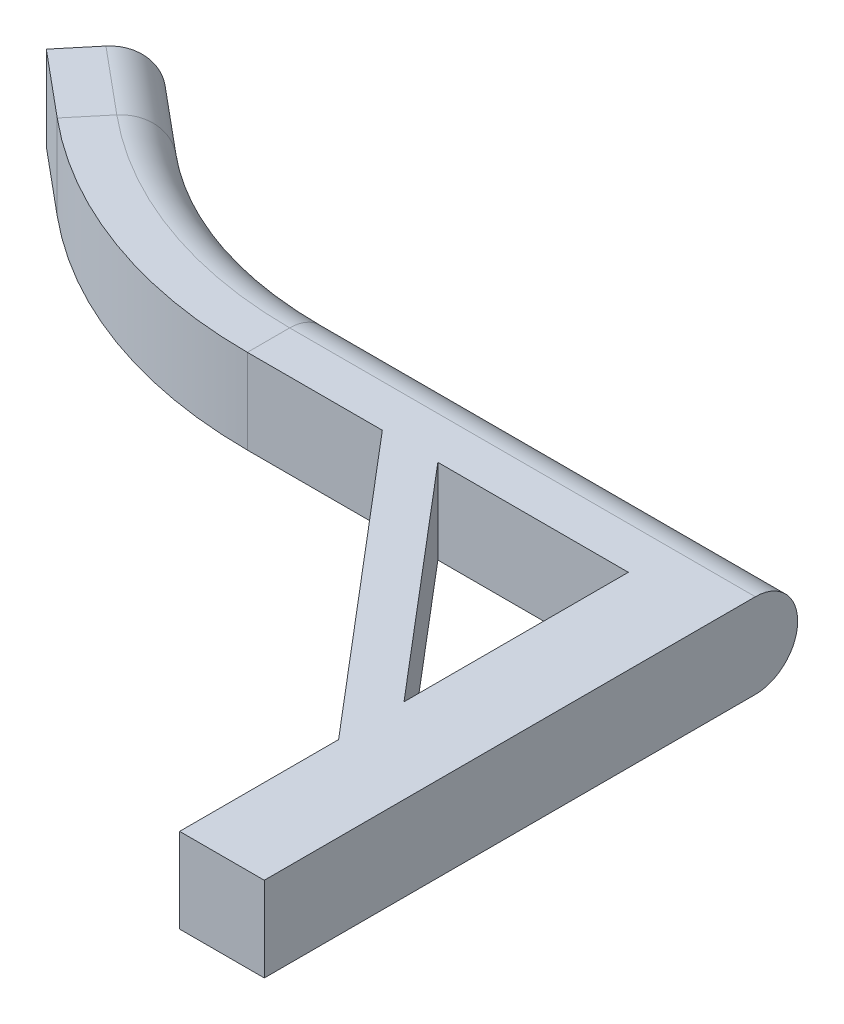
ISO-10303-21;
HEADER;
FILE_DESCRIPTION(('STEP AP214'),'2;1');
FILE_NAME('part.step','',(''),(''),'','','');
FILE_SCHEMA(('AUTOMOTIVE_DESIGN { 1 0 10303 214 1 1 1 1 }'));
ENDSEC;
DATA;
#1=APPLICATION_CONTEXT('core data for automotive mechanical design processes');
#2=APPLICATION_PROTOCOL_DEFINITION('international standard','automotive_design',2000,#1);
#3=PRODUCT_CONTEXT('',#1,'mechanical');
#4=PRODUCT('Part','Part','',(#3));
#5=PRODUCT_RELATED_PRODUCT_CATEGORY('part','',(#4));
#6=PRODUCT_DEFINITION_FORMATION('','',#4);
#7=PRODUCT_DEFINITION_CONTEXT('part definition',#1,'design');
#8=PRODUCT_DEFINITION('design','',#6,#7);
#9=PRODUCT_DEFINITION_SHAPE('','',#8);
#10=(LENGTH_UNIT() NAMED_UNIT(*) SI_UNIT(.MILLI.,.METRE.));
#11=(NAMED_UNIT(*) PLANE_ANGLE_UNIT() SI_UNIT($,.RADIAN.));
#12=(NAMED_UNIT(*) SI_UNIT($,.STERADIAN.) SOLID_ANGLE_UNIT());
#13=UNCERTAINTY_MEASURE_WITH_UNIT(LENGTH_MEASURE(1.E-05),#10,'distance_accuracy_value','');
#14=(GEOMETRIC_REPRESENTATION_CONTEXT(3) GLOBAL_UNCERTAINTY_ASSIGNED_CONTEXT((#13)) GLOBAL_UNIT_ASSIGNED_CONTEXT((#10,
#11,#12)) REPRESENTATION_CONTEXT('',''));
#15=CARTESIAN_POINT('',(0.,0.,0.));
#16=DIRECTION('',(0.,0.,1.));
#17=DIRECTION('',(1.,0.,0.));
#18=AXIS2_PLACEMENT_3D('',#15,#16,#17);
#19=CARTESIAN_POINT('',(2.84999999999999,2.5,-12.));
#20=DIRECTION('',(0.,0.,-1.));
#21=DIRECTION('',(-1.,0.,0.));
#22=AXIS2_PLACEMENT_3D('',#19,#20,#21);
#23=PLANE('',#22);
#24=DIRECTION('',(-1.,0.,0.));
#25=VECTOR('',#24,1.);
#26=CARTESIAN_POINT('',(2.84999999999999,2.5,-12.));
#27=LINE('',#26,#25);
#28=CARTESIAN_POINT('',(-2.50000000000001,2.5,-12.));
#29=VERTEX_POINT('',#28);
#30=CARTESIAN_POINT('',(-13.75,2.5,-12.));
#31=VERTEX_POINT('',#30);
#32=EDGE_CURVE('E173',#29,#31,#27,.T.);
#33=ORIENTED_EDGE('',*,*,#32,.T.);
#34=DIRECTION('',(0.,1.,0.));
#35=VECTOR('',#34,1.);
#36=CARTESIAN_POINT('',(-13.75,-24.9488292496471,-12.));
#37=LINE('',#36,#35);
#38=CARTESIAN_POINT('',(-13.75,-2.5,-12.));
#39=VERTEX_POINT('',#38);
#40=EDGE_CURVE('E65',#39,#31,#37,.T.);
#41=ORIENTED_EDGE('',*,*,#40,.F.);
#42=DIRECTION('',(-1.,0.,0.));
#43=VECTOR('',#42,1.);
#44=CARTESIAN_POINT('',(2.84999999999999,-2.5,-12.));
#45=LINE('',#44,#43);
#46=CARTESIAN_POINT('',(-2.50000000000001,-2.5,-12.));
#47=VERTEX_POINT('',#46);
#48=EDGE_CURVE('E174',#47,#39,#45,.T.);
#49=ORIENTED_EDGE('',*,*,#48,.F.);
#50=DIRECTION('',(0.,1.,0.));
#51=VECTOR('',#50,1.);
#52=CARTESIAN_POINT('',(-2.50000000000001,2.5,-12.));
#53=LINE('',#52,#51);
#54=EDGE_CURVE('E215',#47,#29,#53,.T.);
#55=ORIENTED_EDGE('',*,*,#54,.T.);
#56=EDGE_LOOP('',(#33,#41,#49,#55));
#57=FACE_BOUND('',#56,.T.);
#58=ADVANCED_FACE('F39',(#57),#23,.F.);
#59=CARTESIAN_POINT('',(-2.5,2.5,14.5));
#60=DIRECTION('',(1.,0.,0.));
#61=DIRECTION('',(0.,0.,-1.));
#62=AXIS2_PLACEMENT_3D('',#59,#60,#61);
#63=PLANE('',#62);
#64=DIRECTION('',(0.,0.,-1.));
#65=VECTOR('',#64,1.);
#66=CARTESIAN_POINT('',(-2.5,-2.5,14.5));
#67=LINE('',#66,#65);
#68=CARTESIAN_POINT('',(-2.5,-2.5,1.25));
#69=VERTEX_POINT('',#68);
#70=EDGE_CURVE('E226',#69,#47,#67,.T.);
#71=ORIENTED_EDGE('',*,*,#70,.F.);
#72=DIRECTION('',(0.,1.,0.));
#73=VECTOR('',#72,1.);
#74=CARTESIAN_POINT('',(-2.5,-24.9488292496471,1.25));
#75=LINE('',#74,#73);
#76=CARTESIAN_POINT('',(-2.5,2.5,1.25));
#77=VERTEX_POINT('',#76);
#78=EDGE_CURVE('E196',#69,#77,#75,.T.);
#79=ORIENTED_EDGE('',*,*,#78,.T.);
#80=DIRECTION('',(0.,0.,-1.));
#81=VECTOR('',#80,1.);
#82=CARTESIAN_POINT('',(-2.5,2.5,14.5));
#83=LINE('',#82,#81);
#84=EDGE_CURVE('E230',#77,#29,#83,.T.);
#85=ORIENTED_EDGE('',*,*,#84,.T.);
#86=ORIENTED_EDGE('',*,*,#54,.F.);
#87=EDGE_LOOP('',(#71,#79,#85,#86));
#88=FACE_BOUND('',#87,.T.);
#89=ADVANCED_FACE('F422',(#88),#63,.F.);
#90=CARTESIAN_POINT('',(-44.8418745424597,0.,-23.4906272877014));
#91=DIRECTION('',(0.768374908491942,0.,0.64));
#92=DIRECTION('',(0.64,0.,-0.768374908491942));
#93=AXIS2_PLACEMENT_3D('',#90,#91,#92);
#94=PLANE('',#93);
#95=CARTESIAN_POINT('',(-44.8418745424597,0.,-23.4906272877014));
#96=DIRECTION('',(0.768374908491942,0.,0.64));
#97=DIRECTION('',(0.64,0.,-0.768374908491942));
#98=AXIS2_PLACEMENT_3D('',#95,#96,#97);
#99=CIRCLE('',#98,2.5);
#100=CARTESIAN_POINT('',(-44.8418745424597,2.5,-23.4906272877014));
#101=VERTEX_POINT('',#100);
#102=CARTESIAN_POINT('',(-43.2418745424597,0.,-25.4115645589313));
#103=VERTEX_POINT('',#102);
#104=EDGE_CURVE('E210',#101,#103,#99,.F.);
#105=ORIENTED_EDGE('',*,*,#104,.T.);
#106=CARTESIAN_POINT('',(-44.8418745424597,0.,-23.4906272877014));
#107=DIRECTION('',(0.768374908491942,0.,0.64));
#108=DIRECTION('',(0.64,0.,-0.768374908491942));
#109=AXIS2_PLACEMENT_3D('',#106,#107,#108);
#110=CIRCLE('',#109,2.5);
#111=CARTESIAN_POINT('',(-44.8418745424597,-2.5,-23.4906272877014));
#112=VERTEX_POINT('',#111);
#113=EDGE_CURVE('E302',#103,#112,#110,.F.);
#114=ORIENTED_EDGE('',*,*,#113,.T.);
#115=DIRECTION('',(0.64,0.,-0.768374908491942));
#116=VECTOR('',#115,1.);
#117=CARTESIAN_POINT('',(-46.4418745424597,-2.5,-21.5696900164716));
#118=LINE('',#117,#116);
#119=CARTESIAN_POINT('',(-46.4418745424597,-2.5,-21.5696900164716));
#120=VERTEX_POINT('',#119);
#121=EDGE_CURVE('E254',#120,#112,#118,.T.);
#122=ORIENTED_EDGE('',*,*,#121,.F.);
#123=DIRECTION('',(0.,-1.,0.));
#124=VECTOR('',#123,1.);
#125=CARTESIAN_POINT('',(-46.4418745424597,2.5,-21.5696900164716));
#126=LINE('',#125,#124);
#127=CARTESIAN_POINT('',(-46.4418745424597,2.5,-21.5696900164716));
#128=VERTEX_POINT('',#127);
#129=EDGE_CURVE('E279',#128,#120,#126,.T.);
#130=ORIENTED_EDGE('',*,*,#129,.F.);
#131=DIRECTION('',(-0.64,0.,0.768374908491942));
#132=VECTOR('',#131,1.);
#133=CARTESIAN_POINT('',(-46.4418745424597,2.5,-21.5696900164716));
#134=LINE('',#133,#132);
#135=EDGE_CURVE('E251',#101,#128,#134,.T.);
#136=ORIENTED_EDGE('',*,*,#135,.F.);
#137=EDGE_LOOP('',(#105,#114,#122,#130,#136));
#138=FACE_BOUND('',#137,.T.);
#139=ADVANCED_FACE('F396',(#138),#94,.F.);
#140=CARTESIAN_POINT('',(0.,0.,14.5));
#141=DIRECTION('',(0.,0.,1.));
#142=DIRECTION('',(1.,0.,0.));
#143=AXIS2_PLACEMENT_3D('',#140,#141,#142);
#144=PLANE('',#143);
#145=DIRECTION('',(0.,1.,0.));
#146=VECTOR('',#145,1.);
#147=CARTESIAN_POINT('',(2.5,2.5,14.5));
#148=LINE('',#147,#146);
#149=CARTESIAN_POINT('',(2.5,-2.5,14.5));
#150=VERTEX_POINT('',#149);
#151=CARTESIAN_POINT('',(2.5,2.5,14.5));
#152=VERTEX_POINT('',#151);
#153=EDGE_CURVE('E234',#150,#152,#148,.T.);
#154=ORIENTED_EDGE('',*,*,#153,.T.);
#155=DIRECTION('',(-1.,0.,0.));
#156=VECTOR('',#155,1.);
#157=CARTESIAN_POINT('',(-2.5,2.5,14.5));
#158=LINE('',#157,#156);
#159=CARTESIAN_POINT('',(-2.5,2.5,14.5));
#160=VERTEX_POINT('',#159);
#161=EDGE_CURVE('E242',#152,#160,#158,.T.);
#162=ORIENTED_EDGE('',*,*,#161,.T.);
#163=DIRECTION('',(0.,-1.,0.));
#164=VECTOR('',#163,1.);
#165=CARTESIAN_POINT('',(-2.5,2.5,14.5));
#166=LINE('',#165,#164);
#167=CARTESIAN_POINT('',(-2.5,-2.5,14.5));
#168=VERTEX_POINT('',#167);
#169=EDGE_CURVE('E216',#160,#168,#166,.T.);
#170=ORIENTED_EDGE('',*,*,#169,.T.);
#171=DIRECTION('',(1.,0.,0.));
#172=VECTOR('',#171,1.);
#173=CARTESIAN_POINT('',(-2.5,-2.5,14.5));
#174=LINE('',#173,#172);
#175=EDGE_CURVE('E220',#168,#150,#174,.T.);
#176=ORIENTED_EDGE('',*,*,#175,.T.);
#177=EDGE_LOOP('',(#154,#162,#170,#176));
#178=FACE_BOUND('',#177,.T.);
#179=ADVANCED_FACE('F372',(#178),#144,.T.);
#180=CARTESIAN_POINT('',(-17.0295742067488,-2.5,-12.));
#181=VERTEX_POINT('',#180);
#182=CARTESIAN_POINT('',(-25.,-2.5,-12.));
#183=VERTEX_POINT('',#182);
#184=EDGE_CURVE('E57',#181,#183,#45,.T.);
#185=ORIENTED_EDGE('',*,*,#184,.F.);
#186=DIRECTION('',(0.,1.,0.));
#187=VECTOR('',#186,1.);
#188=CARTESIAN_POINT('',(-17.0295742067488,-24.9488292496471,-12.));
#189=LINE('',#188,#187);
#190=CARTESIAN_POINT('',(-17.0295742067488,2.5,-12.));
#191=VERTEX_POINT('',#190);
#192=EDGE_CURVE('E177',#181,#191,#189,.T.);
#193=ORIENTED_EDGE('',*,*,#192,.T.);
#194=CARTESIAN_POINT('',(-25.,2.5,-12.));
#195=VERTEX_POINT('',#194);
#196=EDGE_CURVE('E162',#191,#195,#27,.T.);
#197=ORIENTED_EDGE('',*,*,#196,.T.);
#198=DIRECTION('',(0.,-1.,0.));
#199=VECTOR('',#198,1.);
#200=CARTESIAN_POINT('',(-25.,2.5,-12.));
#201=LINE('',#200,#199);
#202=EDGE_CURVE('E275',#195,#183,#201,.T.);
#203=ORIENTED_EDGE('',*,*,#202,.T.);
#204=EDGE_LOOP('',(#185,#193,#197,#203));
#205=FACE_BOUND('',#204,.T.);
#206=ADVANCED_FACE('F178',(#205),#23,.F.);
#207=CARTESIAN_POINT('',(-25.,0.,-39.5));
#208=DIRECTION('',(0.,-1.,0.));
#209=DIRECTION('',(0.,0.,-1.));
#210=AXIS2_PLACEMENT_3D('',#207,#208,#209);
#211=CYLINDRICAL_SURFACE('',#210,27.5);
#212=CARTESIAN_POINT('',(-25.,-2.5,-39.5));
#213=DIRECTION('',(0.,-1.,0.));
#214=DIRECTION('',(0.,0.,1.));
#215=AXIS2_PLACEMENT_3D('',#212,#213,#214);
#216=CIRCLE('',#215,27.5);
#217=CARTESIAN_POINT('',(-42.6,-2.5,-18.3696900164716));
#218=VERTEX_POINT('',#217);
#219=EDGE_CURVE('E271',#183,#218,#216,.T.);
#220=ORIENTED_EDGE('',*,*,#219,.F.);
#221=ORIENTED_EDGE('',*,*,#202,.F.);
#222=CARTESIAN_POINT('',(-25.,2.5,-39.5));
#223=DIRECTION('',(0.,-1.,0.));
#224=DIRECTION('',(0.,0.,1.));
#225=AXIS2_PLACEMENT_3D('',#222,#223,#224);
#226=CIRCLE('',#225,27.5);
#227=CARTESIAN_POINT('',(-42.6,2.5,-18.3696900164716));
#228=VERTEX_POINT('',#227);
#229=EDGE_CURVE('E263',#195,#228,#226,.T.);
#230=ORIENTED_EDGE('',*,*,#229,.T.);
#231=DIRECTION('',(0.,-1.,0.));
#232=VECTOR('',#231,1.);
#233=CARTESIAN_POINT('',(-42.6,2.5,-18.3696900164716));
#234=LINE('',#233,#232);
#235=EDGE_CURVE('E288',#228,#218,#234,.T.);
#236=ORIENTED_EDGE('',*,*,#235,.T.);
#237=EDGE_LOOP('',(#220,#221,#230,#236));
#238=FACE_BOUND('',#237,.T.);
#239=ADVANCED_FACE('F405',(#238),#211,.T.);
#240=CARTESIAN_POINT('',(-25.,-2.5,-12.));
#241=DIRECTION('',(0.,1.,0.));
#242=DIRECTION('',(0.,0.,1.));
#243=AXIS2_PLACEMENT_3D('',#240,#241,#242);
#244=PLANE('',#243);
#245=DIRECTION('',(0.64,0.,-0.768374908491942));
#246=VECTOR('',#245,1.);
#247=CARTESIAN_POINT('',(-42.6,-2.5,-18.3696900164716));
#248=LINE('',#247,#246);
#249=CARTESIAN_POINT('',(-41.,-2.5,-20.2906272877014));
#250=VERTEX_POINT('',#249);
#251=EDGE_CURVE('E258',#218,#250,#248,.T.);
#252=ORIENTED_EDGE('',*,*,#251,.T.);
#253=CARTESIAN_POINT('',(-25.,-2.5,-39.5));
#254=DIRECTION('',(0.,1.,0.));
#255=DIRECTION('',(0.,0.,1.));
#256=AXIS2_PLACEMENT_3D('',#253,#254,#255);
#257=CIRCLE('',#256,25.);
#258=CARTESIAN_POINT('',(-25.,-2.5,-14.5));
#259=VERTEX_POINT('',#258);
#260=EDGE_CURVE('E309',#250,#259,#257,.T.);
#261=ORIENTED_EDGE('',*,*,#260,.T.);
#262=DIRECTION('',(0.,0.,-1.));
#263=VECTOR('',#262,1.);
#264=CARTESIAN_POINT('',(-25.,-2.5,-12.));
#265=LINE('',#264,#263);
#266=EDGE_CURVE('E262',#183,#259,#265,.T.);
#267=ORIENTED_EDGE('',*,*,#266,.F.);
#268=ORIENTED_EDGE('',*,*,#219,.T.);
#269=EDGE_LOOP('',(#252,#261,#267,#268));
#270=FACE_BOUND('',#269,.T.);
#271=ADVANCED_FACE('F409',(#270),#244,.F.);
#272=CARTESIAN_POINT('',(-25.,2.5,-12.));
#273=DIRECTION('',(0.,-1.,0.));
#274=DIRECTION('',(0.,0.,-1.));
#275=AXIS2_PLACEMENT_3D('',#272,#273,#274);
#276=PLANE('',#275);
#277=DIRECTION('',(0.,0.,1.));
#278=VECTOR('',#277,1.);
#279=CARTESIAN_POINT('',(-25.,2.5,-12.));
#280=LINE('',#279,#278);
#281=CARTESIAN_POINT('',(-25.,2.5,-14.5));
#282=VERTEX_POINT('',#281);
#283=EDGE_CURVE('E170',#282,#195,#280,.T.);
#284=ORIENTED_EDGE('',*,*,#283,.F.);
#285=CARTESIAN_POINT('',(-25.,2.5,-39.5));
#286=DIRECTION('',(0.,-1.,0.));
#287=DIRECTION('',(0.,0.,-1.));
#288=AXIS2_PLACEMENT_3D('',#285,#286,#287);
#289=CIRCLE('',#288,25.);
#290=CARTESIAN_POINT('',(-41.,2.5,-20.2906272877014));
#291=VERTEX_POINT('',#290);
#292=EDGE_CURVE('E315',#282,#291,#289,.T.);
#293=ORIENTED_EDGE('',*,*,#292,.T.);
#294=DIRECTION('',(-0.64,0.,0.768374908491942));
#295=VECTOR('',#294,1.);
#296=CARTESIAN_POINT('',(-42.6,2.5,-18.3696900164716));
#297=LINE('',#296,#295);
#298=EDGE_CURVE('E255',#291,#228,#297,.T.);
#299=ORIENTED_EDGE('',*,*,#298,.T.);
#300=ORIENTED_EDGE('',*,*,#229,.F.);
#301=EDGE_LOOP('',(#284,#293,#299,#300));
#302=FACE_BOUND('',#301,.T.);
#303=ADVANCED_FACE('F407',(#302),#276,.F.);
#304=CARTESIAN_POINT('',(-42.6,2.5,-18.3696900164716));
#305=DIRECTION('',(0.64,0.,-0.768374908491942));
#306=DIRECTION('',(-0.768374908491942,0.,-0.64));
#307=AXIS2_PLACEMENT_3D('',#304,#305,#306);
#308=PLANE('',#307);
#309=DIRECTION('',(-0.768374908491942,0.,-0.64));
#310=VECTOR('',#309,1.);
#311=CARTESIAN_POINT('',(-42.6,-2.5,-18.3696900164716));
#312=LINE('',#311,#310);
#313=EDGE_CURVE('E267',#218,#120,#312,.T.);
#314=ORIENTED_EDGE('',*,*,#313,.F.);
#315=ORIENTED_EDGE('',*,*,#235,.F.);
#316=DIRECTION('',(-0.768374908491942,0.,-0.64));
#317=VECTOR('',#316,1.);
#318=CARTESIAN_POINT('',(-42.6,2.5,-18.3696900164716));
#319=LINE('',#318,#317);
#320=EDGE_CURVE('E259',#228,#128,#319,.T.);
#321=ORIENTED_EDGE('',*,*,#320,.T.);
#322=ORIENTED_EDGE('',*,*,#129,.T.);
#323=EDGE_LOOP('',(#314,#315,#321,#322));
#324=FACE_BOUND('',#323,.T.);
#325=ADVANCED_FACE('F400',(#324),#308,.F.);
#326=CARTESIAN_POINT('',(-42.6,-2.5,-18.3696900164716));
#327=DIRECTION('',(0.,1.,0.));
#328=DIRECTION('',(0.,0.,1.));
#329=AXIS2_PLACEMENT_3D('',#326,#327,#328);
#330=PLANE('',#329);
#331=ORIENTED_EDGE('',*,*,#121,.T.);
#332=DIRECTION('',(-0.768374908491942,0.,-0.64));
#333=VECTOR('',#332,1.);
#334=CARTESIAN_POINT('',(-41.,-2.5,-20.2906272877014));
#335=LINE('',#334,#333);
#336=EDGE_CURVE('E305',#112,#250,#335,.F.);
#337=ORIENTED_EDGE('',*,*,#336,.T.);
#338=ORIENTED_EDGE('',*,*,#251,.F.);
#339=ORIENTED_EDGE('',*,*,#313,.T.);
#340=EDGE_LOOP('',(#331,#337,#338,#339));
#341=FACE_BOUND('',#340,.T.);
#342=ADVANCED_FACE('F415',(#341),#330,.F.);
#343=CARTESIAN_POINT('',(-42.6,2.5,-18.3696900164716));
#344=DIRECTION('',(0.,-1.,0.));
#345=DIRECTION('',(0.,0.,-1.));
#346=AXIS2_PLACEMENT_3D('',#343,#344,#345);
#347=PLANE('',#346);
#348=ORIENTED_EDGE('',*,*,#298,.F.);
#349=DIRECTION('',(-0.768374908491942,0.,-0.64));
#350=VECTOR('',#349,1.);
#351=CARTESIAN_POINT('',(-41.,2.5,-20.2906272877014));
#352=LINE('',#351,#350);
#353=EDGE_CURVE('E312',#291,#101,#352,.T.);
#354=ORIENTED_EDGE('',*,*,#353,.T.);
#355=ORIENTED_EDGE('',*,*,#135,.T.);
#356=ORIENTED_EDGE('',*,*,#320,.F.);
#357=EDGE_LOOP('',(#348,#354,#355,#356));
#358=FACE_BOUND('',#357,.T.);
#359=ADVANCED_FACE('F392',(#358),#347,.F.);
#360=CARTESIAN_POINT('',(-2.5,2.5,14.5));
#361=DIRECTION('',(0.,-1.,0.));
#362=DIRECTION('',(1.,0.,0.));
#363=AXIS2_PLACEMENT_3D('',#360,#361,#362);
#364=PLANE('',#363);
#365=DIRECTION('',(-1.,0.,0.));
#366=VECTOR('',#365,1.);
#367=CARTESIAN_POINT('',(2.84999999999999,2.5,-14.5));
#368=LINE('',#367,#366);
#369=CARTESIAN_POINT('',(0.,2.5,-14.5));
#370=VERTEX_POINT('',#369);
#371=EDGE_CURVE('E49',#370,#282,#368,.T.);
#372=ORIENTED_EDGE('',*,*,#371,.T.);
#373=ORIENTED_EDGE('',*,*,#283,.T.);
#374=ORIENTED_EDGE('',*,*,#196,.F.);
#375=DIRECTION('',(0.647230821935947,0.,0.762294079169003));
#376=VECTOR('',#375,1.);
#377=CARTESIAN_POINT('',(-17.0295742067488,2.5,-12.));
#378=LINE('',#377,#376);
#379=CARTESIAN_POINT('',(-2.5,2.5,5.11260962128193));
#380=VERTEX_POINT('',#379);
#381=EDGE_CURVE('E167',#191,#380,#378,.T.);
#382=ORIENTED_EDGE('',*,*,#381,.T.);
#383=EDGE_CURVE('E227',#160,#380,#83,.T.);
#384=ORIENTED_EDGE('',*,*,#383,.F.);
#385=ORIENTED_EDGE('',*,*,#161,.F.);
#386=DIRECTION('',(0.,0.,-1.));
#387=VECTOR('',#386,1.);
#388=CARTESIAN_POINT('',(2.5,2.5,14.5));
#389=LINE('',#388,#387);
#390=CARTESIAN_POINT('',(2.49999999999999,2.5,-14.5));
#391=VERTEX_POINT('',#390);
#392=EDGE_CURVE('E238',#152,#391,#389,.T.);
#393=ORIENTED_EDGE('',*,*,#392,.T.);
#394=DIRECTION('',(-1.,0.,0.));
#395=VECTOR('',#394,1.);
#396=CARTESIAN_POINT('',(1.24999999999999,2.5,-14.5));
#397=LINE('',#396,#395);
#398=EDGE_CURVE('E11',#391,#370,#397,.T.);
#399=ORIENTED_EDGE('',*,*,#398,.T.);
#400=EDGE_LOOP('',(#372,#373,#374,#382,#384,#385,#393,#399));
#401=FACE_BOUND('',#400,.T.);
#402=ORIENTED_EDGE('',*,*,#84,.F.);
#403=DIRECTION('',(-0.647230821935947,0.,-0.762294079169003));
#404=VECTOR('',#403,1.);
#405=CARTESIAN_POINT('',(-13.75,2.5,-12.));
#406=LINE('',#405,#404);
#407=EDGE_CURVE('E182',#77,#31,#406,.T.);
#408=ORIENTED_EDGE('',*,*,#407,.T.);
#409=ORIENTED_EDGE('',*,*,#32,.F.);
#410=EDGE_LOOP('',(#402,#408,#409));
#411=FACE_BOUND('',#410,.T.);
#412=ADVANCED_FACE('F164',(#401,#411),#364,.F.);
#413=CARTESIAN_POINT('',(2.5,2.5,14.5));
#414=DIRECTION('',(-1.,0.,0.));
#415=DIRECTION('',(0.,0.,1.));
#416=AXIS2_PLACEMENT_3D('',#413,#414,#415);
#417=PLANE('',#416);
#418=DIRECTION('',(0.,0.,-1.));
#419=VECTOR('',#418,1.);
#420=CARTESIAN_POINT('',(2.5,-2.5,14.5));
#421=LINE('',#420,#419);
#422=CARTESIAN_POINT('',(2.49999999999999,-2.5,-14.5));
#423=VERTEX_POINT('',#422);
#424=EDGE_CURVE('E225',#150,#423,#421,.T.);
#425=ORIENTED_EDGE('',*,*,#424,.T.);
#426=CARTESIAN_POINT('',(2.49999999999999,0.,-14.5));
#427=DIRECTION('',(-1.,0.,0.));
#428=DIRECTION('',(0.,0.,1.));
#429=AXIS2_PLACEMENT_3D('',#426,#427,#428);
#430=CIRCLE('',#429,2.5);
#431=CARTESIAN_POINT('',(2.49999999999999,0.,-17.));
#432=VERTEX_POINT('',#431);
#433=EDGE_CURVE('E327',#423,#432,#430,.F.);
#434=ORIENTED_EDGE('',*,*,#433,.T.);
#435=CARTESIAN_POINT('',(2.49999999999999,0.,-14.5));
#436=DIRECTION('',(-1.,0.,0.));
#437=DIRECTION('',(0.,0.,1.));
#438=AXIS2_PLACEMENT_3D('',#435,#436,#437);
#439=CIRCLE('',#438,2.5);
#440=EDGE_CURVE('E324',#432,#391,#439,.F.);
#441=ORIENTED_EDGE('',*,*,#440,.T.);
#442=ORIENTED_EDGE('',*,*,#392,.F.);
#443=ORIENTED_EDGE('',*,*,#153,.F.);
#444=EDGE_LOOP('',(#425,#434,#441,#442,#443));
#445=FACE_BOUND('',#444,.T.);
#446=ADVANCED_FACE('F369',(#445),#417,.F.);
#447=CARTESIAN_POINT('',(-2.5,-2.5,14.5));
#448=DIRECTION('',(0.,1.,0.));
#449=DIRECTION('',(0.,0.,1.));
#450=AXIS2_PLACEMENT_3D('',#447,#448,#449);
#451=PLANE('',#450);
#452=ORIENTED_EDGE('',*,*,#48,.T.);
#453=DIRECTION('',(0.647230821935947,0.,0.762294079169003));
#454=VECTOR('',#453,1.);
#455=CARTESIAN_POINT('',(-13.75,-2.5,-12.));
#456=LINE('',#455,#454);
#457=EDGE_CURVE('E192',#39,#69,#456,.T.);
#458=ORIENTED_EDGE('',*,*,#457,.T.);
#459=ORIENTED_EDGE('',*,*,#70,.T.);
#460=EDGE_LOOP('',(#452,#458,#459));
#461=FACE_BOUND('',#460,.T.);
#462=DIRECTION('',(-1.,0.,0.));
#463=VECTOR('',#462,1.);
#464=CARTESIAN_POINT('',(1.24999999999999,-2.5,-14.5));
#465=LINE('',#464,#463);
#466=CARTESIAN_POINT('',(0.,-2.5,-14.5));
#467=VERTEX_POINT('',#466);
#468=EDGE_CURVE('E321',#467,#423,#465,.F.);
#469=ORIENTED_EDGE('',*,*,#468,.T.);
#470=ORIENTED_EDGE('',*,*,#424,.F.);
#471=ORIENTED_EDGE('',*,*,#175,.F.);
#472=CARTESIAN_POINT('',(-2.5,-2.5,5.11260962128193));
#473=VERTEX_POINT('',#472);
#474=EDGE_CURVE('E221',#168,#473,#67,.T.);
#475=ORIENTED_EDGE('',*,*,#474,.T.);
#476=DIRECTION('',(-0.647230821935947,0.,-0.762294079169003));
#477=VECTOR('',#476,1.);
#478=CARTESIAN_POINT('',(-17.0295742067488,-2.5,-12.));
#479=LINE('',#478,#477);
#480=EDGE_CURVE('E202',#473,#181,#479,.T.);
#481=ORIENTED_EDGE('',*,*,#480,.T.);
#482=ORIENTED_EDGE('',*,*,#184,.T.);
#483=ORIENTED_EDGE('',*,*,#266,.T.);
#484=DIRECTION('',(-1.,0.,0.));
#485=VECTOR('',#484,1.);
#486=CARTESIAN_POINT('',(2.84999999999999,-2.5,-14.5));
#487=LINE('',#486,#485);
#488=EDGE_CURVE('E318',#259,#467,#487,.F.);
#489=ORIENTED_EDGE('',*,*,#488,.T.);
#490=EDGE_LOOP('',(#469,#470,#471,#475,#481,#482,#483,#489));
#491=FACE_BOUND('',#490,.T.);
#492=ADVANCED_FACE('F376',(#461,#491),#451,.F.);
#493=ORIENTED_EDGE('',*,*,#383,.T.);
#494=DIRECTION('',(0.,1.,0.));
#495=VECTOR('',#494,1.);
#496=CARTESIAN_POINT('',(-2.5,-24.9488292496471,5.11260962128193));
#497=LINE('',#496,#495);
#498=EDGE_CURVE('E181',#473,#380,#497,.T.);
#499=ORIENTED_EDGE('',*,*,#498,.F.);
#500=ORIENTED_EDGE('',*,*,#474,.F.);
#501=ORIENTED_EDGE('',*,*,#169,.F.);
#502=EDGE_LOOP('',(#493,#499,#500,#501));
#503=FACE_BOUND('',#502,.T.);
#504=ADVANCED_FACE('F429',(#503),#63,.F.);
#505=CARTESIAN_POINT('',(2.84999999999999,0.,-14.5));
#506=DIRECTION('',(-1.,0.,0.));
#507=DIRECTION('',(0.,0.,1.));
#508=AXIS2_PLACEMENT_3D('',#505,#506,#507);
#509=CYLINDRICAL_SURFACE('',#508,2.5);
#510=ORIENTED_EDGE('',*,*,#398,.F.);
#511=ORIENTED_EDGE('',*,*,#440,.F.);
#512=DIRECTION('',(-1.,0.,0.));
#513=VECTOR('',#512,1.);
#514=CARTESIAN_POINT('',(2.84999999999999,0.,-17.));
#515=LINE('',#514,#513);
#516=CARTESIAN_POINT('',(-25.,0.,-17.));
#517=VERTEX_POINT('',#516);
#518=EDGE_CURVE('E43',#517,#432,#515,.F.);
#519=ORIENTED_EDGE('',*,*,#518,.F.);
#520=CARTESIAN_POINT('',(-25.,0.,-14.5));
#521=DIRECTION('',(-1.,0.,0.));
#522=DIRECTION('',(0.,0.,1.));
#523=AXIS2_PLACEMENT_3D('',#520,#521,#522);
#524=CIRCLE('',#523,2.5);
#525=EDGE_CURVE('E349',#282,#517,#524,.T.);
#526=ORIENTED_EDGE('',*,*,#525,.F.);
#527=ORIENTED_EDGE('',*,*,#371,.F.);
#528=EDGE_LOOP('',(#510,#511,#519,#526,#527));
#529=FACE_BOUND('',#528,.T.);
#530=ADVANCED_FACE('F41',(#529),#509,.T.);
#531=CARTESIAN_POINT('',(2.84999999999999,0.,-14.5));
#532=DIRECTION('',(-1.,0.,0.));
#533=DIRECTION('',(0.,0.,1.));
#534=AXIS2_PLACEMENT_3D('',#531,#532,#533);
#535=CYLINDRICAL_SURFACE('',#534,2.5);
#536=ORIENTED_EDGE('',*,*,#468,.F.);
#537=ORIENTED_EDGE('',*,*,#488,.F.);
#538=CARTESIAN_POINT('',(-25.,0.,-14.5));
#539=DIRECTION('',(-1.,0.,0.));
#540=DIRECTION('',(0.,0.,1.));
#541=AXIS2_PLACEMENT_3D('',#538,#539,#540);
#542=CIRCLE('',#541,2.5);
#543=EDGE_CURVE('E346',#517,#259,#542,.T.);
#544=ORIENTED_EDGE('',*,*,#543,.F.);
#545=ORIENTED_EDGE('',*,*,#518,.T.);
#546=ORIENTED_EDGE('',*,*,#433,.F.);
#547=EDGE_LOOP('',(#536,#537,#544,#545,#546));
#548=FACE_BOUND('',#547,.T.);
#549=ADVANCED_FACE('F361',(#548),#535,.T.);
#550=CARTESIAN_POINT('',(-25.,0.,-39.5));
#551=DIRECTION('',(0.,-1.,0.));
#552=DIRECTION('',(0.,0.,-1.));
#553=AXIS2_PLACEMENT_3D('',#550,#551,#552);
#554=TOROIDAL_SURFACE('',#553,25.,2.5);
#555=ORIENTED_EDGE('',*,*,#292,.F.);
#556=ORIENTED_EDGE('',*,*,#525,.T.);
#557=CARTESIAN_POINT('',(-25.,0.,-39.5));
#558=DIRECTION('',(0.,-1.,0.));
#559=DIRECTION('',(0.,0.,-1.));
#560=AXIS2_PLACEMENT_3D('',#557,#558,#559);
#561=CIRCLE('',#560,22.5);
#562=CARTESIAN_POINT('',(-39.4,0.,-22.2115645589313));
#563=VERTEX_POINT('',#562);
#564=EDGE_CURVE('E342',#563,#517,#561,.F.);
#565=ORIENTED_EDGE('',*,*,#564,.F.);
#566=CARTESIAN_POINT('',(-41.,0.,-20.2906272877014));
#567=DIRECTION('',(-0.768374908491942,0.,-0.64));
#568=DIRECTION('',(-0.64,0.,0.768374908491942));
#569=AXIS2_PLACEMENT_3D('',#566,#567,#568);
#570=CIRCLE('',#569,2.5);
#571=EDGE_CURVE('E338',#291,#563,#570,.T.);
#572=ORIENTED_EDGE('',*,*,#571,.F.);
#573=EDGE_LOOP('',(#555,#556,#565,#572));
#574=FACE_BOUND('',#573,.T.);
#575=ADVANCED_FACE('F382',(#574),#554,.T.);
#576=CARTESIAN_POINT('',(-25.,0.,-39.5));
#577=DIRECTION('',(0.,1.,0.));
#578=DIRECTION('',(0.,0.,1.));
#579=AXIS2_PLACEMENT_3D('',#576,#577,#578);
#580=TOROIDAL_SURFACE('',#579,25.,2.5);
#581=ORIENTED_EDGE('',*,*,#543,.T.);
#582=ORIENTED_EDGE('',*,*,#260,.F.);
#583=CARTESIAN_POINT('',(-41.,0.,-20.2906272877014));
#584=DIRECTION('',(-0.768374908491943,0.,-0.639999999999999));
#585=DIRECTION('',(-0.639999999999999,0.,0.768374908491943));
#586=AXIS2_PLACEMENT_3D('',#583,#584,#585);
#587=CIRCLE('',#586,2.5);
#588=EDGE_CURVE('E335',#563,#250,#587,.T.);
#589=ORIENTED_EDGE('',*,*,#588,.F.);
#590=ORIENTED_EDGE('',*,*,#564,.T.);
#591=EDGE_LOOP('',(#581,#582,#589,#590));
#592=FACE_BOUND('',#591,.T.);
#593=ADVANCED_FACE('F379',(#592),#580,.T.);
#594=CARTESIAN_POINT('',(-41.,0.,-20.2906272877014));
#595=DIRECTION('',(-0.768374908491942,0.,-0.64));
#596=DIRECTION('',(-0.64,0.,0.768374908491942));
#597=AXIS2_PLACEMENT_3D('',#594,#595,#596);
#598=CYLINDRICAL_SURFACE('',#597,2.5);
#599=ORIENTED_EDGE('',*,*,#353,.F.);
#600=ORIENTED_EDGE('',*,*,#571,.T.);
#601=DIRECTION('',(-0.768374908491942,0.,-0.64));
#602=VECTOR('',#601,1.);
#603=CARTESIAN_POINT('',(-39.4,0.,-22.2115645589313));
#604=LINE('',#603,#602);
#605=EDGE_CURVE('E205',#103,#563,#604,.F.);
#606=ORIENTED_EDGE('',*,*,#605,.F.);
#607=ORIENTED_EDGE('',*,*,#104,.F.);
#608=EDGE_LOOP('',(#599,#600,#606,#607));
#609=FACE_BOUND('',#608,.T.);
#610=ADVANCED_FACE('F386',(#609),#598,.T.);
#611=CARTESIAN_POINT('',(-41.,0.,-20.2906272877014));
#612=DIRECTION('',(-0.768374908491942,0.,-0.64));
#613=DIRECTION('',(-0.64,0.,0.768374908491942));
#614=AXIS2_PLACEMENT_3D('',#611,#612,#613);
#615=CYLINDRICAL_SURFACE('',#614,2.5);
#616=ORIENTED_EDGE('',*,*,#588,.T.);
#617=ORIENTED_EDGE('',*,*,#336,.F.);
#618=ORIENTED_EDGE('',*,*,#113,.F.);
#619=ORIENTED_EDGE('',*,*,#605,.T.);
#620=EDGE_LOOP('',(#616,#617,#618,#619));
#621=FACE_BOUND('',#620,.T.);
#622=ADVANCED_FACE('F442',(#621),#615,.T.);
#623=CARTESIAN_POINT('',(-13.75,-24.9488292496471,-12.));
#624=DIRECTION('',(0.762294079169003,0.,-0.647230821935947));
#625=DIRECTION('',(-0.647230821935947,0.,-0.762294079169003));
#626=AXIS2_PLACEMENT_3D('',#623,#624,#625);
#627=PLANE('',#626);
#628=ORIENTED_EDGE('',*,*,#457,.F.);
#629=ORIENTED_EDGE('',*,*,#40,.T.);
#630=ORIENTED_EDGE('',*,*,#407,.F.);
#631=ORIENTED_EDGE('',*,*,#78,.F.);
#632=EDGE_LOOP('',(#628,#629,#630,#631));
#633=FACE_BOUND('',#632,.T.);
#634=ADVANCED_FACE('F445',(#633),#627,.T.);
#635=CARTESIAN_POINT('',(-17.0295742067488,-24.9488292496471,-12.));
#636=DIRECTION('',(-0.762294079169003,0.,0.647230821935947));
#637=DIRECTION('',(0.647230821935947,0.,0.762294079169003));
#638=AXIS2_PLACEMENT_3D('',#635,#636,#637);
#639=PLANE('',#638);
#640=ORIENTED_EDGE('',*,*,#480,.F.);
#641=ORIENTED_EDGE('',*,*,#498,.T.);
#642=ORIENTED_EDGE('',*,*,#381,.F.);
#643=ORIENTED_EDGE('',*,*,#192,.F.);
#644=EDGE_LOOP('',(#640,#641,#642,#643));
#645=FACE_BOUND('',#644,.T.);
#646=ADVANCED_FACE('F184',(#645),#639,.T.);
#647=CLOSED_SHELL('',(#58,#89,#139,#179,#206,#239,#271,#303,#325,#342,#359,#412,#446,#492,#504,
#530,#549,#575,#593,#610,#622,#634,#646));
#648=MANIFOLD_SOLID_BREP('B2',#647);
#649=ADVANCED_BREP_SHAPE_REPRESENTATION('',(#18,#648),#14);
#650=SHAPE_DEFINITION_REPRESENTATION(#9,#649);
ENDSEC;
END-ISO-10303-21;
